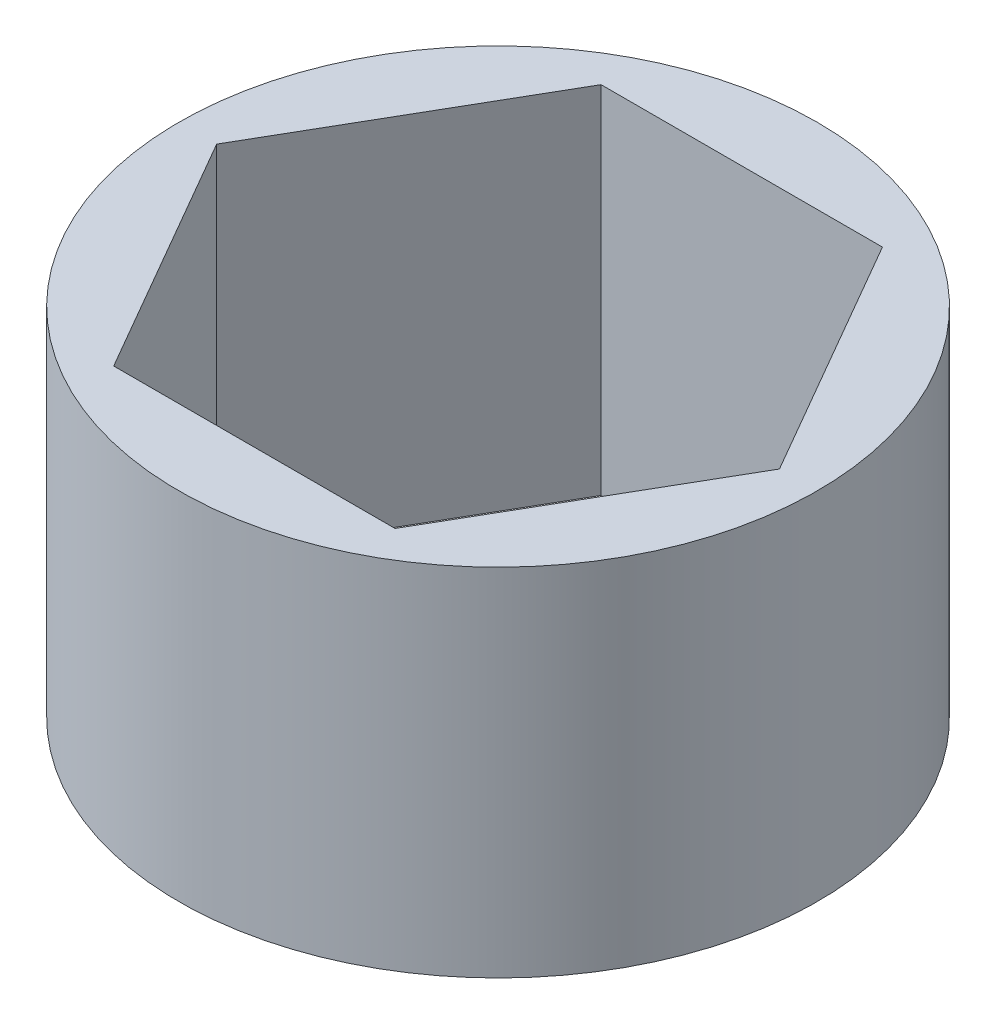
ISO-10303-21;
HEADER;
FILE_DESCRIPTION(('STEP AP214'),'2;1');
FILE_NAME('part.step','',(''),(''),'','','');
FILE_SCHEMA(('AUTOMOTIVE_DESIGN { 1 0 10303 214 1 1 1 1 }'));
ENDSEC;
DATA;
#1=APPLICATION_CONTEXT('core data for automotive mechanical design processes');
#2=APPLICATION_PROTOCOL_DEFINITION('international standard','automotive_design',2000,#1);
#3=PRODUCT_CONTEXT('',#1,'mechanical');
#4=PRODUCT('Part','Part','',(#3));
#5=PRODUCT_RELATED_PRODUCT_CATEGORY('part','',(#4));
#6=PRODUCT_DEFINITION_FORMATION('','',#4);
#7=PRODUCT_DEFINITION_CONTEXT('part definition',#1,'design');
#8=PRODUCT_DEFINITION('design','',#6,#7);
#9=PRODUCT_DEFINITION_SHAPE('','',#8);
#10=(LENGTH_UNIT() NAMED_UNIT(*) SI_UNIT(.MILLI.,.METRE.));
#11=(NAMED_UNIT(*) PLANE_ANGLE_UNIT() SI_UNIT($,.RADIAN.));
#12=(NAMED_UNIT(*) SI_UNIT($,.STERADIAN.) SOLID_ANGLE_UNIT());
#13=UNCERTAINTY_MEASURE_WITH_UNIT(LENGTH_MEASURE(1.E-05),#10,'distance_accuracy_value','');
#14=(GEOMETRIC_REPRESENTATION_CONTEXT(3) GLOBAL_UNCERTAINTY_ASSIGNED_CONTEXT((#13)) GLOBAL_UNIT_ASSIGNED_CONTEXT((#10,
#11,#12)) REPRESENTATION_CONTEXT('',''));
#15=CARTESIAN_POINT('',(0.,0.,0.));
#16=DIRECTION('',(0.,0.,1.));
#17=DIRECTION('',(1.,0.,0.));
#18=AXIS2_PLACEMENT_3D('',#15,#16,#17);
#19=CARTESIAN_POINT('',(-3.66617420935407,9.271,6.35000000000004));
#20=DIRECTION('',(0.,0.,-1.));
#21=DIRECTION('',(-1.,0.,0.));
#22=AXIS2_PLACEMENT_3D('',#19,#20,#21);
#23=PLANE('',#22);
#24=DIRECTION('',(1.,0.,0.));
#25=VECTOR('',#24,1.);
#26=CARTESIAN_POINT('',(0.,9.271,6.34999999999996));
#27=LINE('',#26,#25);
#28=CARTESIAN_POINT('',(3.66617420935419,9.271,6.34999999999996));
#29=VERTEX_POINT('',#28);
#30=CARTESIAN_POINT('',(-3.66617420935408,9.271,6.35000000000002));
#31=VERTEX_POINT('',#30);
#32=EDGE_CURVE('E83',#29,#31,#27,.F.);
#33=ORIENTED_EDGE('',*,*,#32,.F.);
#34=DIRECTION('',(0.,1.,0.));
#35=VECTOR('',#34,1.);
#36=CARTESIAN_POINT('',(3.66617420935419,9.271,6.34999999999996));
#37=LINE('',#36,#35);
#38=CARTESIAN_POINT('',(3.66617420935419,0.,6.34999999999996));
#39=VERTEX_POINT('',#38);
#40=EDGE_CURVE('E75',#39,#29,#37,.T.);
#41=ORIENTED_EDGE('',*,*,#40,.F.);
#42=DIRECTION('',(1.,0.,0.));
#43=VECTOR('',#42,1.);
#44=CARTESIAN_POINT('',(0.,0.,6.34999999999996));
#45=LINE('',#44,#43);
#46=CARTESIAN_POINT('',(-3.66617420935408,0.,6.35000000000002));
#47=VERTEX_POINT('',#46);
#48=EDGE_CURVE('E115',#39,#47,#45,.F.);
#49=ORIENTED_EDGE('',*,*,#48,.T.);
#50=DIRECTION('',(0.,1.,0.));
#51=VECTOR('',#50,1.);
#52=CARTESIAN_POINT('',(-3.66617420935407,9.271,6.35000000000004));
#53=LINE('',#52,#51);
#54=EDGE_CURVE('E100',#31,#47,#53,.F.);
#55=ORIENTED_EDGE('',*,*,#54,.F.);
#56=EDGE_LOOP('',(#33,#41,#49,#55));
#57=FACE_BOUND('',#56,.T.);
#58=ADVANCED_FACE('F16',(#57),#23,.T.);
#59=CARTESIAN_POINT('',(-7.33234841870825,9.271,0.));
#60=DIRECTION('',(0.866025403784434,0.,-0.500000000000008));
#61=DIRECTION('',(-0.500000000000008,0.,-0.866025403784434));
#62=AXIS2_PLACEMENT_3D('',#59,#60,#61);
#63=PLANE('',#62);
#64=DIRECTION('',(-0.500000000000008,0.,-0.866025403784434));
#65=VECTOR('',#64,1.);
#66=CARTESIAN_POINT('',(-3.66617420935407,9.271,6.35000000000004));
#67=LINE('',#66,#65);
#68=CARTESIAN_POINT('',(-7.33234841870825,9.271,0.));
#69=VERTEX_POINT('',#68);
#70=EDGE_CURVE('E108',#31,#69,#67,.T.);
#71=ORIENTED_EDGE('',*,*,#70,.F.);
#72=ORIENTED_EDGE('',*,*,#54,.T.);
#73=DIRECTION('',(-0.500000000000008,0.,-0.866025403784434));
#74=VECTOR('',#73,1.);
#75=CARTESIAN_POINT('',(-3.66617420935407,0.,6.35000000000004));
#76=LINE('',#75,#74);
#77=CARTESIAN_POINT('',(-7.33234841870825,0.,0.));
#78=VERTEX_POINT('',#77);
#79=EDGE_CURVE('E106',#47,#78,#76,.T.);
#80=ORIENTED_EDGE('',*,*,#79,.T.);
#81=DIRECTION('',(0.,1.,0.));
#82=VECTOR('',#81,1.);
#83=CARTESIAN_POINT('',(-7.33234841870825,9.271,0.));
#84=LINE('',#83,#82);
#85=EDGE_CURVE('E97',#69,#78,#84,.F.);
#86=ORIENTED_EDGE('',*,*,#85,.F.);
#87=EDGE_LOOP('',(#71,#72,#80,#86));
#88=FACE_BOUND('',#87,.T.);
#89=ADVANCED_FACE('F105',(#88),#63,.T.);
#90=CARTESIAN_POINT('',(-3.66617420935419,9.271,-6.34999999999996));
#91=DIRECTION('',(0.866025403784444,0.,0.499999999999991));
#92=DIRECTION('',(0.499999999999991,0.,-0.866025403784444));
#93=AXIS2_PLACEMENT_3D('',#90,#91,#92);
#94=PLANE('',#93);
#95=DIRECTION('',(0.499999999999991,0.,-0.866025403784444));
#96=VECTOR('',#95,1.);
#97=CARTESIAN_POINT('',(-7.33234841870825,9.271,0.));
#98=LINE('',#97,#96);
#99=CARTESIAN_POINT('',(-3.66617420935419,9.271,-6.34999999999996));
#100=VERTEX_POINT('',#99);
#101=EDGE_CURVE('E125',#69,#100,#98,.T.);
#102=ORIENTED_EDGE('',*,*,#101,.F.);
#103=ORIENTED_EDGE('',*,*,#85,.T.);
#104=DIRECTION('',(0.499999999999991,0.,-0.866025403784444));
#105=VECTOR('',#104,1.);
#106=CARTESIAN_POINT('',(-7.33234841870825,0.,0.));
#107=LINE('',#106,#105);
#108=CARTESIAN_POINT('',(-3.66617420935419,0.,-6.34999999999996));
#109=VERTEX_POINT('',#108);
#110=EDGE_CURVE('E117',#78,#109,#107,.T.);
#111=ORIENTED_EDGE('',*,*,#110,.T.);
#112=DIRECTION('',(0.,1.,0.));
#113=VECTOR('',#112,1.);
#114=CARTESIAN_POINT('',(-3.66617420935419,9.271,-6.34999999999996));
#115=LINE('',#114,#113);
#116=EDGE_CURVE('E94',#100,#109,#115,.F.);
#117=ORIENTED_EDGE('',*,*,#116,.F.);
#118=EDGE_LOOP('',(#102,#103,#111,#117));
#119=FACE_BOUND('',#118,.T.);
#120=ADVANCED_FACE('F134',(#119),#94,.T.);
#121=CARTESIAN_POINT('',(3.66617420935405,9.271,-6.35000000000004));
#122=DIRECTION('',(0.,0.,1.));
#123=DIRECTION('',(1.,0.,0.));
#124=AXIS2_PLACEMENT_3D('',#121,#122,#123);
#125=PLANE('',#124);
#126=DIRECTION('',(1.,0.,0.));
#127=VECTOR('',#126,1.);
#128=CARTESIAN_POINT('',(0.,9.271,-6.34999999999996));
#129=LINE('',#128,#127);
#130=CARTESIAN_POINT('',(3.66617420935406,9.271,-6.35000000000002));
#131=VERTEX_POINT('',#130);
#132=EDGE_CURVE('E88',#100,#131,#129,.T.);
#133=ORIENTED_EDGE('',*,*,#132,.F.);
#134=ORIENTED_EDGE('',*,*,#116,.T.);
#135=DIRECTION('',(1.,0.,0.));
#136=VECTOR('',#135,1.);
#137=CARTESIAN_POINT('',(0.,0.,-6.34999999999996));
#138=LINE('',#137,#136);
#139=CARTESIAN_POINT('',(3.66617420935406,0.,-6.35000000000002));
#140=VERTEX_POINT('',#139);
#141=EDGE_CURVE('E119',#109,#140,#138,.T.);
#142=ORIENTED_EDGE('',*,*,#141,.T.);
#143=DIRECTION('',(0.,1.,0.));
#144=VECTOR('',#143,1.);
#145=CARTESIAN_POINT('',(3.66617420935405,9.271,-6.35000000000004));
#146=LINE('',#145,#144);
#147=EDGE_CURVE('E64',#131,#140,#146,.F.);
#148=ORIENTED_EDGE('',*,*,#147,.F.);
#149=EDGE_LOOP('',(#133,#134,#142,#148));
#150=FACE_BOUND('',#149,.T.);
#151=ADVANCED_FACE('F131',(#150),#125,.T.);
#152=CARTESIAN_POINT('',(7.33234841870825,9.271,0.));
#153=DIRECTION('',(-0.866025403784433,0.,0.500000000000009));
#154=DIRECTION('',(0.500000000000009,0.,0.866025403784433));
#155=AXIS2_PLACEMENT_3D('',#152,#153,#154);
#156=PLANE('',#155);
#157=DIRECTION('',(0.50000000000001,0.,0.866025403784433));
#158=VECTOR('',#157,1.);
#159=CARTESIAN_POINT('',(3.66617420935405,9.271,-6.35000000000004));
#160=LINE('',#159,#158);
#161=CARTESIAN_POINT('',(7.33234841870825,9.271,0.));
#162=VERTEX_POINT('',#161);
#163=EDGE_CURVE('E70',#131,#162,#160,.T.);
#164=ORIENTED_EDGE('',*,*,#163,.F.);
#165=ORIENTED_EDGE('',*,*,#147,.T.);
#166=DIRECTION('',(0.50000000000001,0.,0.866025403784433));
#167=VECTOR('',#166,1.);
#168=CARTESIAN_POINT('',(3.66617420935405,0.,-6.35000000000004));
#169=LINE('',#168,#167);
#170=CARTESIAN_POINT('',(7.33234841870825,0.,0.));
#171=VERTEX_POINT('',#170);
#172=EDGE_CURVE('E32',#140,#171,#169,.T.);
#173=ORIENTED_EDGE('',*,*,#172,.T.);
#174=DIRECTION('',(0.,1.,0.));
#175=VECTOR('',#174,1.);
#176=CARTESIAN_POINT('',(7.33234841870825,9.271,0.));
#177=LINE('',#176,#175);
#178=EDGE_CURVE('E66',#162,#171,#177,.F.);
#179=ORIENTED_EDGE('',*,*,#178,.F.);
#180=EDGE_LOOP('',(#164,#165,#173,#179));
#181=FACE_BOUND('',#180,.T.);
#182=ADVANCED_FACE('F68',(#181),#156,.T.);
#183=CARTESIAN_POINT('',(3.66617420935419,9.271,6.34999999999996));
#184=DIRECTION('',(-0.866025403784444,0.,-0.499999999999991));
#185=DIRECTION('',(-0.499999999999991,0.,0.866025403784444));
#186=AXIS2_PLACEMENT_3D('',#183,#184,#185);
#187=PLANE('',#186);
#188=DIRECTION('',(-0.499999999999991,0.,0.866025403784444));
#189=VECTOR('',#188,1.);
#190=CARTESIAN_POINT('',(7.33234841870825,9.271,0.));
#191=LINE('',#190,#189);
#192=EDGE_CURVE('E78',#162,#29,#191,.T.);
#193=ORIENTED_EDGE('',*,*,#192,.F.);
#194=ORIENTED_EDGE('',*,*,#178,.T.);
#195=DIRECTION('',(-0.499999999999991,0.,0.866025403784444));
#196=VECTOR('',#195,1.);
#197=CARTESIAN_POINT('',(7.33234841870825,0.,0.));
#198=LINE('',#197,#196);
#199=EDGE_CURVE('E127',#171,#39,#198,.T.);
#200=ORIENTED_EDGE('',*,*,#199,.T.);
#201=ORIENTED_EDGE('',*,*,#40,.T.);
#202=EDGE_LOOP('',(#193,#194,#200,#201));
#203=FACE_BOUND('',#202,.T.);
#204=ADVANCED_FACE('F79',(#203),#187,.T.);
#205=CARTESIAN_POINT('',(0.,9.271,0.));
#206=DIRECTION('',(0.,1.,0.));
#207=DIRECTION('',(0.,0.,1.));
#208=AXIS2_PLACEMENT_3D('',#205,#206,#207);
#209=PLANE('',#208);
#210=ORIENTED_EDGE('',*,*,#101,.T.);
#211=ORIENTED_EDGE('',*,*,#132,.T.);
#212=ORIENTED_EDGE('',*,*,#163,.T.);
#213=ORIENTED_EDGE('',*,*,#192,.T.);
#214=ORIENTED_EDGE('',*,*,#32,.T.);
#215=ORIENTED_EDGE('',*,*,#70,.T.);
#216=EDGE_LOOP('',(#210,#211,#212,#213,#214,#215));
#217=FACE_BOUND('',#216,.T.);
#218=CARTESIAN_POINT('',(0.,9.271,0.));
#219=DIRECTION('',(0.,-1.,0.));
#220=DIRECTION('',(0.,0.,-1.));
#221=AXIS2_PLACEMENT_3D('',#218,#219,#220);
#222=CIRCLE('',#221,8.3185);
#223=CARTESIAN_POINT('',(0.,9.271,-8.3185));
#224=VERTEX_POINT('',#223);
#225=EDGE_CURVE('E19',#224,#224,#222,.T.);
#226=ORIENTED_EDGE('',*,*,#225,.F.);
#227=EDGE_LOOP('',(#226));
#228=FACE_BOUND('',#227,.T.);
#229=ADVANCED_FACE('F86',(#217,#228),#209,.T.);
#230=CARTESIAN_POINT('',(0.,0.,0.));
#231=DIRECTION('',(0.,1.,0.));
#232=DIRECTION('',(0.,0.,1.));
#233=AXIS2_PLACEMENT_3D('',#230,#231,#232);
#234=PLANE('',#233);
#235=ORIENTED_EDGE('',*,*,#172,.F.);
#236=ORIENTED_EDGE('',*,*,#141,.F.);
#237=ORIENTED_EDGE('',*,*,#110,.F.);
#238=ORIENTED_EDGE('',*,*,#79,.F.);
#239=ORIENTED_EDGE('',*,*,#48,.F.);
#240=ORIENTED_EDGE('',*,*,#199,.F.);
#241=EDGE_LOOP('',(#235,#236,#237,#238,#239,#240));
#242=FACE_BOUND('',#241,.T.);
#243=CARTESIAN_POINT('',(0.,0.,0.));
#244=DIRECTION('',(0.,-1.,0.));
#245=DIRECTION('',(0.,0.,-1.));
#246=AXIS2_PLACEMENT_3D('',#243,#244,#245);
#247=CIRCLE('',#246,8.3185);
#248=CARTESIAN_POINT('',(0.,0.,-8.3185));
#249=VERTEX_POINT('',#248);
#250=EDGE_CURVE('E11',#249,#249,#247,.F.);
#251=ORIENTED_EDGE('',*,*,#250,.F.);
#252=EDGE_LOOP('',(#251));
#253=FACE_BOUND('',#252,.T.);
#254=ADVANCED_FACE('F113',(#242,#253),#234,.F.);
#255=CARTESIAN_POINT('',(0.,9.271,0.));
#256=DIRECTION('',(0.,-1.,0.));
#257=DIRECTION('',(0.,0.,-1.));
#258=AXIS2_PLACEMENT_3D('',#255,#256,#257);
#259=CYLINDRICAL_SURFACE('',#258,8.3185);
#260=ORIENTED_EDGE('',*,*,#250,.T.);
#261=EDGE_LOOP('',(#260));
#262=FACE_BOUND('',#261,.T.);
#263=ORIENTED_EDGE('',*,*,#225,.T.);
#264=EDGE_LOOP('',(#263));
#265=FACE_BOUND('',#264,.T.);
#266=ADVANCED_FACE('F143',(#262,#265),#259,.T.);
#267=CLOSED_SHELL('',(#58,#89,#120,#151,#182,#204,#229,#254,#266));
#268=MANIFOLD_SOLID_BREP('B1',#267);
#269=ADVANCED_BREP_SHAPE_REPRESENTATION('',(#18,#268),#14);
#270=SHAPE_DEFINITION_REPRESENTATION(#9,#269);
ENDSEC;
END-ISO-10303-21;
